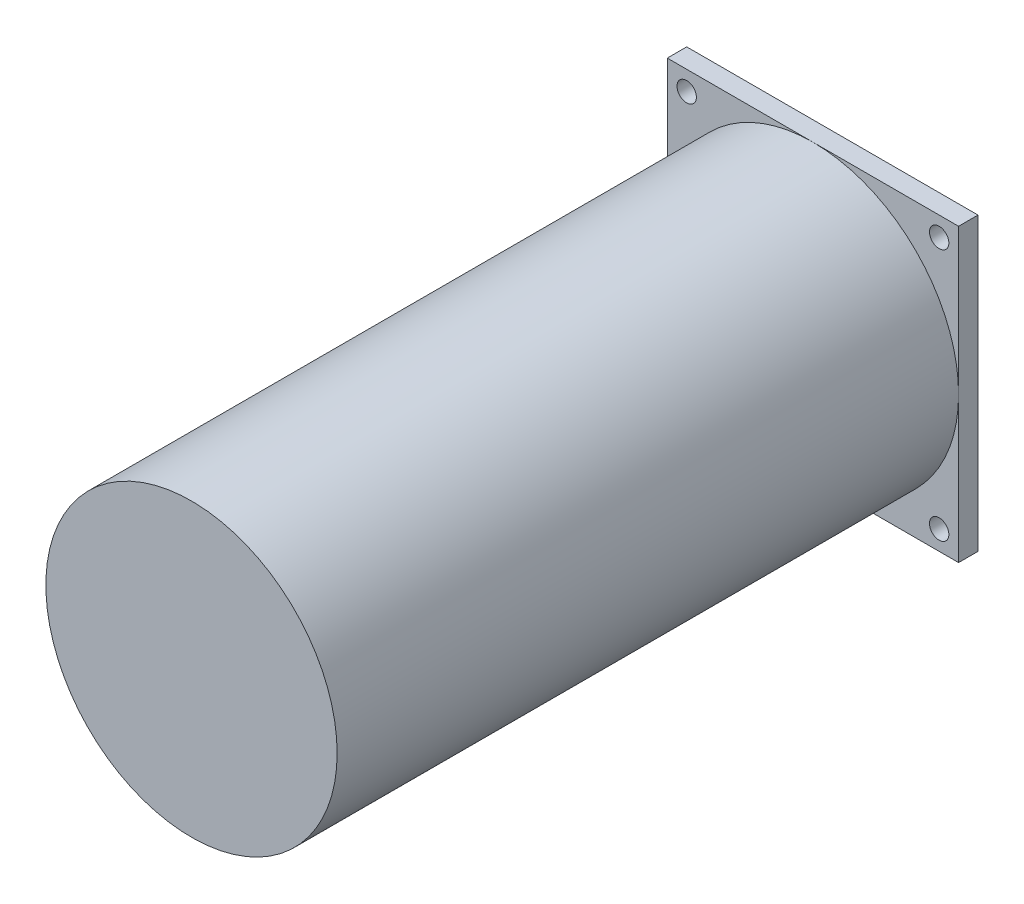
ISO-10303-21;
HEADER;
FILE_DESCRIPTION(('STEP AP214'),'2;1');
FILE_NAME('part.step','',(''),(''),'','','');
FILE_SCHEMA(('AUTOMOTIVE_DESIGN { 1 0 10303 214 1 1 1 1 }'));
ENDSEC;
DATA;
#1=APPLICATION_CONTEXT('core data for automotive mechanical design processes');
#2=APPLICATION_PROTOCOL_DEFINITION('international standard','automotive_design',2000,#1);
#3=PRODUCT_CONTEXT('',#1,'mechanical');
#4=PRODUCT('Part','Part','',(#3));
#5=PRODUCT_RELATED_PRODUCT_CATEGORY('part','',(#4));
#6=PRODUCT_DEFINITION_FORMATION('','',#4);
#7=PRODUCT_DEFINITION_CONTEXT('part definition',#1,'design');
#8=PRODUCT_DEFINITION('design','',#6,#7);
#9=PRODUCT_DEFINITION_SHAPE('','',#8);
#10=(LENGTH_UNIT() NAMED_UNIT(*) SI_UNIT(.MILLI.,.METRE.));
#11=(NAMED_UNIT(*) PLANE_ANGLE_UNIT() SI_UNIT($,.RADIAN.));
#12=(NAMED_UNIT(*) SI_UNIT($,.STERADIAN.) SOLID_ANGLE_UNIT());
#13=UNCERTAINTY_MEASURE_WITH_UNIT(LENGTH_MEASURE(1.E-05),#10,'distance_accuracy_value','');
#14=(GEOMETRIC_REPRESENTATION_CONTEXT(3) GLOBAL_UNCERTAINTY_ASSIGNED_CONTEXT((#13)) GLOBAL_UNIT_ASSIGNED_CONTEXT((#10,
#11,#12)) REPRESENTATION_CONTEXT('',''));
#15=CARTESIAN_POINT('',(0.,0.,0.));
#16=DIRECTION('',(0.,0.,1.));
#17=DIRECTION('',(1.,0.,0.));
#18=AXIS2_PLACEMENT_3D('',#15,#16,#17);
#19=CARTESIAN_POINT('',(0.,0.,10.));
#20=DIRECTION('',(0.,0.,1.));
#21=DIRECTION('',(1.,0.,0.));
#22=AXIS2_PLACEMENT_3D('',#19,#20,#21);
#23=PLANE('',#22);
#24=CARTESIAN_POINT('',(0.,0.,10.));
#25=DIRECTION('',(0.,0.,1.));
#26=DIRECTION('',(1.,0.,0.));
#27=AXIS2_PLACEMENT_3D('',#24,#25,#26);
#28=CIRCLE('',#27,75.);
#29=CARTESIAN_POINT('',(75.,0.,10.));
#30=VERTEX_POINT('',#29);
#31=CARTESIAN_POINT('',(0.,75.,10.));
#32=VERTEX_POINT('',#31);
#33=EDGE_CURVE('E57',#30,#32,#28,.T.);
#34=ORIENTED_EDGE('',*,*,#33,.F.);
#35=DIRECTION('',(0.,1.,0.));
#36=VECTOR('',#35,1.);
#37=CARTESIAN_POINT('',(75.,75.,10.));
#38=LINE('',#37,#36);
#39=CARTESIAN_POINT('',(75.,75.,10.));
#40=VERTEX_POINT('',#39);
#41=EDGE_CURVE('E110',#30,#40,#38,.T.);
#42=ORIENTED_EDGE('',*,*,#41,.T.);
#43=DIRECTION('',(-1.,0.,0.));
#44=VECTOR('',#43,1.);
#45=CARTESIAN_POINT('',(-75.,75.,10.));
#46=LINE('',#45,#44);
#47=EDGE_CURVE('E123',#40,#32,#46,.T.);
#48=ORIENTED_EDGE('',*,*,#47,.T.);
#49=EDGE_LOOP('',(#34,#42,#48));
#50=FACE_BOUND('',#49,.T.);
#51=CARTESIAN_POINT('',(65.,65.,10.));
#52=DIRECTION('',(0.,0.,1.));
#53=DIRECTION('',(1.,0.,0.));
#54=AXIS2_PLACEMENT_3D('',#51,#52,#53);
#55=CIRCLE('',#54,5.00000000000001);
#56=CARTESIAN_POINT('',(70.,65.,10.));
#57=VERTEX_POINT('',#56);
#58=EDGE_CURVE('E151',#57,#57,#55,.T.);
#59=ORIENTED_EDGE('',*,*,#58,.F.);
#60=EDGE_LOOP('',(#59));
#61=FACE_BOUND('',#60,.T.);
#62=ADVANCED_FACE('F45',(#50,#61),#23,.T.);
#63=CARTESIAN_POINT('',(-75.,0.,10.));
#64=VERTEX_POINT('',#63);
#65=EDGE_CURVE('E11',#32,#64,#28,.T.);
#66=ORIENTED_EDGE('',*,*,#65,.F.);
#67=CARTESIAN_POINT('',(-75.,75.,10.));
#68=VERTEX_POINT('',#67);
#69=EDGE_CURVE('E109',#32,#68,#46,.T.);
#70=ORIENTED_EDGE('',*,*,#69,.T.);
#71=DIRECTION('',(0.,-1.,0.));
#72=VECTOR('',#71,1.);
#73=CARTESIAN_POINT('',(-75.,75.,10.));
#74=LINE('',#73,#72);
#75=EDGE_CURVE('E170',#68,#64,#74,.T.);
#76=ORIENTED_EDGE('',*,*,#75,.T.);
#77=EDGE_LOOP('',(#66,#70,#76));
#78=FACE_BOUND('',#77,.T.);
#79=CARTESIAN_POINT('',(-65.,65.,10.));
#80=DIRECTION('',(0.,0.,1.));
#81=DIRECTION('',(1.,0.,0.));
#82=AXIS2_PLACEMENT_3D('',#79,#80,#81);
#83=CIRCLE('',#82,5.00000000000001);
#84=CARTESIAN_POINT('',(-60.,65.,10.));
#85=VERTEX_POINT('',#84);
#86=EDGE_CURVE('E159',#85,#85,#83,.T.);
#87=ORIENTED_EDGE('',*,*,#86,.F.);
#88=EDGE_LOOP('',(#87));
#89=FACE_BOUND('',#88,.T.);
#90=ADVANCED_FACE('F213',(#78,#89),#23,.T.);
#91=CARTESIAN_POINT('',(0.,-75.,10.));
#92=VERTEX_POINT('',#91);
#93=EDGE_CURVE('E55',#64,#92,#28,.T.);
#94=ORIENTED_EDGE('',*,*,#93,.F.);
#95=CARTESIAN_POINT('',(-75.,-75.,10.));
#96=VERTEX_POINT('',#95);
#97=EDGE_CURVE('E169',#64,#96,#74,.T.);
#98=ORIENTED_EDGE('',*,*,#97,.T.);
#99=DIRECTION('',(1.,0.,0.));
#100=VECTOR('',#99,1.);
#101=CARTESIAN_POINT('',(-75.,-75.,10.));
#102=LINE('',#101,#100);
#103=EDGE_CURVE('E174',#96,#92,#102,.T.);
#104=ORIENTED_EDGE('',*,*,#103,.T.);
#105=EDGE_LOOP('',(#94,#98,#104));
#106=FACE_BOUND('',#105,.T.);
#107=CARTESIAN_POINT('',(-65.,-65.,10.));
#108=DIRECTION('',(0.,0.,1.));
#109=DIRECTION('',(1.,0.,0.));
#110=AXIS2_PLACEMENT_3D('',#107,#108,#109);
#111=CIRCLE('',#110,5.);
#112=CARTESIAN_POINT('',(-60.,-65.,10.));
#113=VERTEX_POINT('',#112);
#114=EDGE_CURVE('E134',#113,#113,#111,.T.);
#115=ORIENTED_EDGE('',*,*,#114,.F.);
#116=EDGE_LOOP('',(#115));
#117=FACE_BOUND('',#116,.T.);
#118=ADVANCED_FACE('F239',(#106,#117),#23,.T.);
#119=EDGE_CURVE('E64',#92,#30,#28,.T.);
#120=ORIENTED_EDGE('',*,*,#119,.F.);
#121=CARTESIAN_POINT('',(75.,-75.,10.));
#122=VERTEX_POINT('',#121);
#123=EDGE_CURVE('E104',#92,#122,#102,.T.);
#124=ORIENTED_EDGE('',*,*,#123,.T.);
#125=EDGE_CURVE('E100',#122,#30,#38,.T.);
#126=ORIENTED_EDGE('',*,*,#125,.T.);
#127=EDGE_LOOP('',(#120,#124,#126));
#128=FACE_BOUND('',#127,.T.);
#129=CARTESIAN_POINT('',(65.,-65.,10.));
#130=DIRECTION('',(0.,0.,1.));
#131=DIRECTION('',(1.,0.,0.));
#132=AXIS2_PLACEMENT_3D('',#129,#130,#131);
#133=CIRCLE('',#132,5.00000000000001);
#134=CARTESIAN_POINT('',(70.,-65.,10.));
#135=VERTEX_POINT('',#134);
#136=EDGE_CURVE('E143',#135,#135,#133,.T.);
#137=ORIENTED_EDGE('',*,*,#136,.F.);
#138=EDGE_LOOP('',(#137));
#139=FACE_BOUND('',#138,.T.);
#140=ADVANCED_FACE('F102',(#128,#139),#23,.T.);
#141=CARTESIAN_POINT('',(0.,0.,0.));
#142=DIRECTION('',(0.,0.,1.));
#143=DIRECTION('',(1.,0.,0.));
#144=AXIS2_PLACEMENT_3D('',#141,#142,#143);
#145=PLANE('',#144);
#146=DIRECTION('',(0.,1.,0.));
#147=VECTOR('',#146,1.);
#148=CARTESIAN_POINT('',(75.,75.,0.));
#149=LINE('',#148,#147);
#150=CARTESIAN_POINT('',(75.,-75.,0.));
#151=VERTEX_POINT('',#150);
#152=CARTESIAN_POINT('',(75.,75.,0.));
#153=VERTEX_POINT('',#152);
#154=EDGE_CURVE('E163',#151,#153,#149,.T.);
#155=ORIENTED_EDGE('',*,*,#154,.F.);
#156=DIRECTION('',(1.,0.,0.));
#157=VECTOR('',#156,1.);
#158=CARTESIAN_POINT('',(-75.,-75.,0.));
#159=LINE('',#158,#157);
#160=CARTESIAN_POINT('',(-75.,-75.,0.));
#161=VERTEX_POINT('',#160);
#162=EDGE_CURVE('E120',#161,#151,#159,.T.);
#163=ORIENTED_EDGE('',*,*,#162,.F.);
#164=DIRECTION('',(0.,-1.,0.));
#165=VECTOR('',#164,1.);
#166=CARTESIAN_POINT('',(-75.,75.,0.));
#167=LINE('',#166,#165);
#168=CARTESIAN_POINT('',(-75.,75.,0.));
#169=VERTEX_POINT('',#168);
#170=EDGE_CURVE('E183',#169,#161,#167,.T.);
#171=ORIENTED_EDGE('',*,*,#170,.F.);
#172=DIRECTION('',(-1.,0.,0.));
#173=VECTOR('',#172,1.);
#174=CARTESIAN_POINT('',(-75.,75.,0.));
#175=LINE('',#174,#173);
#176=EDGE_CURVE('E180',#153,#169,#175,.T.);
#177=ORIENTED_EDGE('',*,*,#176,.F.);
#178=EDGE_LOOP('',(#155,#163,#171,#177));
#179=FACE_BOUND('',#178,.T.);
#180=CARTESIAN_POINT('',(-65.,65.,0.));
#181=DIRECTION('',(0.,0.,1.));
#182=DIRECTION('',(1.,0.,0.));
#183=AXIS2_PLACEMENT_3D('',#180,#181,#182);
#184=CIRCLE('',#183,5.00000000000001);
#185=CARTESIAN_POINT('',(-60.,65.,0.));
#186=VERTEX_POINT('',#185);
#187=EDGE_CURVE('E155',#186,#186,#184,.T.);
#188=ORIENTED_EDGE('',*,*,#187,.T.);
#189=EDGE_LOOP('',(#188));
#190=FACE_BOUND('',#189,.T.);
#191=CARTESIAN_POINT('',(65.,65.,0.));
#192=DIRECTION('',(0.,0.,1.));
#193=DIRECTION('',(1.,0.,0.));
#194=AXIS2_PLACEMENT_3D('',#191,#192,#193);
#195=CIRCLE('',#194,5.00000000000001);
#196=CARTESIAN_POINT('',(70.,65.,0.));
#197=VERTEX_POINT('',#196);
#198=EDGE_CURVE('E147',#197,#197,#195,.T.);
#199=ORIENTED_EDGE('',*,*,#198,.T.);
#200=EDGE_LOOP('',(#199));
#201=FACE_BOUND('',#200,.T.);
#202=CARTESIAN_POINT('',(65.,-65.,0.));
#203=DIRECTION('',(0.,0.,1.));
#204=DIRECTION('',(1.,0.,0.));
#205=AXIS2_PLACEMENT_3D('',#202,#203,#204);
#206=CIRCLE('',#205,5.00000000000001);
#207=CARTESIAN_POINT('',(70.,-65.,0.));
#208=VERTEX_POINT('',#207);
#209=EDGE_CURVE('E138',#208,#208,#206,.T.);
#210=ORIENTED_EDGE('',*,*,#209,.T.);
#211=EDGE_LOOP('',(#210));
#212=FACE_BOUND('',#211,.T.);
#213=CARTESIAN_POINT('',(-65.,-65.,0.));
#214=DIRECTION('',(0.,0.,1.));
#215=DIRECTION('',(1.,0.,0.));
#216=AXIS2_PLACEMENT_3D('',#213,#214,#215);
#217=CIRCLE('',#216,5.);
#218=CARTESIAN_POINT('',(-60.,-65.,0.));
#219=VERTEX_POINT('',#218);
#220=EDGE_CURVE('E139',#219,#219,#217,.T.);
#221=ORIENTED_EDGE('',*,*,#220,.T.);
#222=EDGE_LOOP('',(#221));
#223=FACE_BOUND('',#222,.T.);
#224=ADVANCED_FACE('F206',(#179,#190,#201,#212,#223),#145,.F.);
#225=CARTESIAN_POINT('',(75.,75.,10.));
#226=DIRECTION('',(-1.,0.,0.));
#227=DIRECTION('',(0.,-1.,0.));
#228=AXIS2_PLACEMENT_3D('',#225,#226,#227);
#229=PLANE('',#228);
#230=ORIENTED_EDGE('',*,*,#154,.T.);
#231=DIRECTION('',(0.,0.,-1.));
#232=VECTOR('',#231,1.);
#233=CARTESIAN_POINT('',(75.,75.,10.));
#234=LINE('',#233,#232);
#235=EDGE_CURVE('E49',#40,#153,#234,.T.);
#236=ORIENTED_EDGE('',*,*,#235,.F.);
#237=ORIENTED_EDGE('',*,*,#41,.F.);
#238=ORIENTED_EDGE('',*,*,#125,.F.);
#239=DIRECTION('',(0.,0.,-1.));
#240=VECTOR('',#239,1.);
#241=CARTESIAN_POINT('',(75.,-75.,10.));
#242=LINE('',#241,#240);
#243=EDGE_CURVE('E177',#122,#151,#242,.T.);
#244=ORIENTED_EDGE('',*,*,#243,.T.);
#245=EDGE_LOOP('',(#230,#236,#237,#238,#244));
#246=FACE_BOUND('',#245,.T.);
#247=ADVANCED_FACE('F47',(#246),#229,.F.);
#248=CARTESIAN_POINT('',(-75.,75.,10.));
#249=DIRECTION('',(0.,-1.,0.));
#250=DIRECTION('',(0.,0.,-1.));
#251=AXIS2_PLACEMENT_3D('',#248,#249,#250);
#252=PLANE('',#251);
#253=ORIENTED_EDGE('',*,*,#176,.T.);
#254=DIRECTION('',(0.,0.,-1.));
#255=VECTOR('',#254,1.);
#256=CARTESIAN_POINT('',(-75.,75.,10.));
#257=LINE('',#256,#255);
#258=EDGE_CURVE('E131',#68,#169,#257,.T.);
#259=ORIENTED_EDGE('',*,*,#258,.F.);
#260=ORIENTED_EDGE('',*,*,#69,.F.);
#261=ORIENTED_EDGE('',*,*,#47,.F.);
#262=ORIENTED_EDGE('',*,*,#235,.T.);
#263=EDGE_LOOP('',(#253,#259,#260,#261,#262));
#264=FACE_BOUND('',#263,.T.);
#265=ADVANCED_FACE('F326',(#264),#252,.F.);
#266=CARTESIAN_POINT('',(-75.,75.,10.));
#267=DIRECTION('',(1.,0.,0.));
#268=DIRECTION('',(0.,1.,0.));
#269=AXIS2_PLACEMENT_3D('',#266,#267,#268);
#270=PLANE('',#269);
#271=ORIENTED_EDGE('',*,*,#170,.T.);
#272=DIRECTION('',(0.,0.,-1.));
#273=VECTOR('',#272,1.);
#274=CARTESIAN_POINT('',(-75.,-75.,10.));
#275=LINE('',#274,#273);
#276=EDGE_CURVE('E190',#96,#161,#275,.T.);
#277=ORIENTED_EDGE('',*,*,#276,.F.);
#278=ORIENTED_EDGE('',*,*,#97,.F.);
#279=ORIENTED_EDGE('',*,*,#75,.F.);
#280=ORIENTED_EDGE('',*,*,#258,.T.);
#281=EDGE_LOOP('',(#271,#277,#278,#279,#280));
#282=FACE_BOUND('',#281,.T.);
#283=ADVANCED_FACE('F199',(#282),#270,.F.);
#284=CARTESIAN_POINT('',(-75.,-75.,10.));
#285=DIRECTION('',(0.,1.,0.));
#286=DIRECTION('',(0.,0.,1.));
#287=AXIS2_PLACEMENT_3D('',#284,#285,#286);
#288=PLANE('',#287);
#289=ORIENTED_EDGE('',*,*,#162,.T.);
#290=ORIENTED_EDGE('',*,*,#243,.F.);
#291=ORIENTED_EDGE('',*,*,#123,.F.);
#292=ORIENTED_EDGE('',*,*,#103,.F.);
#293=ORIENTED_EDGE('',*,*,#276,.T.);
#294=EDGE_LOOP('',(#289,#290,#291,#292,#293));
#295=FACE_BOUND('',#294,.T.);
#296=ADVANCED_FACE('F209',(#295),#288,.F.);
#297=CARTESIAN_POINT('',(-65.,65.,10.));
#298=DIRECTION('',(0.,0.,-1.));
#299=DIRECTION('',(-1.,0.,0.));
#300=AXIS2_PLACEMENT_3D('',#297,#298,#299);
#301=CYLINDRICAL_SURFACE('',#300,5.00000000000001);
#302=ORIENTED_EDGE('',*,*,#86,.T.);
#303=EDGE_LOOP('',(#302));
#304=FACE_BOUND('',#303,.T.);
#305=ORIENTED_EDGE('',*,*,#187,.F.);
#306=EDGE_LOOP('',(#305));
#307=FACE_BOUND('',#306,.T.);
#308=ADVANCED_FACE('F301',(#304,#307),#301,.F.);
#309=CARTESIAN_POINT('',(65.,65.,10.));
#310=DIRECTION('',(0.,0.,-1.));
#311=DIRECTION('',(-1.,0.,0.));
#312=AXIS2_PLACEMENT_3D('',#309,#310,#311);
#313=CYLINDRICAL_SURFACE('',#312,5.00000000000001);
#314=ORIENTED_EDGE('',*,*,#58,.T.);
#315=EDGE_LOOP('',(#314));
#316=FACE_BOUND('',#315,.T.);
#317=ORIENTED_EDGE('',*,*,#198,.F.);
#318=EDGE_LOOP('',(#317));
#319=FACE_BOUND('',#318,.T.);
#320=ADVANCED_FACE('F291',(#316,#319),#313,.F.);
#321=CARTESIAN_POINT('',(65.,-65.,10.));
#322=DIRECTION('',(0.,0.,-1.));
#323=DIRECTION('',(-1.,0.,0.));
#324=AXIS2_PLACEMENT_3D('',#321,#322,#323);
#325=CYLINDRICAL_SURFACE('',#324,5.00000000000001);
#326=ORIENTED_EDGE('',*,*,#136,.T.);
#327=EDGE_LOOP('',(#326));
#328=FACE_BOUND('',#327,.T.);
#329=ORIENTED_EDGE('',*,*,#209,.F.);
#330=EDGE_LOOP('',(#329));
#331=FACE_BOUND('',#330,.T.);
#332=ADVANCED_FACE('F231',(#328,#331),#325,.F.);
#333=CARTESIAN_POINT('',(-65.,-65.,10.));
#334=DIRECTION('',(0.,0.,-1.));
#335=DIRECTION('',(-1.,0.,0.));
#336=AXIS2_PLACEMENT_3D('',#333,#334,#335);
#337=CYLINDRICAL_SURFACE('',#336,5.);
#338=ORIENTED_EDGE('',*,*,#114,.T.);
#339=EDGE_LOOP('',(#338));
#340=FACE_BOUND('',#339,.T.);
#341=ORIENTED_EDGE('',*,*,#220,.F.);
#342=EDGE_LOOP('',(#341));
#343=FACE_BOUND('',#342,.T.);
#344=ADVANCED_FACE('F223',(#340,#343),#337,.F.);
#345=CARTESIAN_POINT('',(0.,0.,330.));
#346=DIRECTION('',(0.,0.,-1.));
#347=DIRECTION('',(-1.,0.,0.));
#348=AXIS2_PLACEMENT_3D('',#345,#346,#347);
#349=CYLINDRICAL_SURFACE('',#348,75.);
#350=CARTESIAN_POINT('',(0.,0.,330.));
#351=DIRECTION('',(0.,0.,1.));
#352=DIRECTION('',(1.,0.,0.));
#353=AXIS2_PLACEMENT_3D('',#350,#351,#352);
#354=CIRCLE('',#353,75.);
#355=CARTESIAN_POINT('',(75.,0.,330.));
#356=VERTEX_POINT('',#355);
#357=EDGE_CURVE('E126',#356,#356,#354,.T.);
#358=ORIENTED_EDGE('',*,*,#357,.F.);
#359=EDGE_LOOP('',(#358));
#360=FACE_BOUND('',#359,.T.);
#361=ORIENTED_EDGE('',*,*,#33,.T.);
#362=ORIENTED_EDGE('',*,*,#65,.T.);
#363=ORIENTED_EDGE('',*,*,#93,.T.);
#364=ORIENTED_EDGE('',*,*,#119,.T.);
#365=EDGE_LOOP('',(#361,#362,#363,#364));
#366=FACE_BOUND('',#365,.T.);
#367=ADVANCED_FACE('F127',(#360,#366),#349,.T.);
#368=CARTESIAN_POINT('',(0.,0.,330.));
#369=DIRECTION('',(0.,0.,1.));
#370=DIRECTION('',(1.,0.,0.));
#371=AXIS2_PLACEMENT_3D('',#368,#369,#370);
#372=PLANE('',#371);
#373=ORIENTED_EDGE('',*,*,#357,.T.);
#374=EDGE_LOOP('',(#373));
#375=FACE_BOUND('',#374,.T.);
#376=ADVANCED_FACE('F220',(#375),#372,.T.);
#377=CLOSED_SHELL('',(#62,#90,#118,#140,#224,#247,#265,#283,#296,#308,#320,#332,#344,#367,#376));
#378=MANIFOLD_SOLID_BREP('B2',#377);
#379=ADVANCED_BREP_SHAPE_REPRESENTATION('',(#18,#378),#14);
#380=SHAPE_DEFINITION_REPRESENTATION(#9,#379);
ENDSEC;
END-ISO-10303-21;
